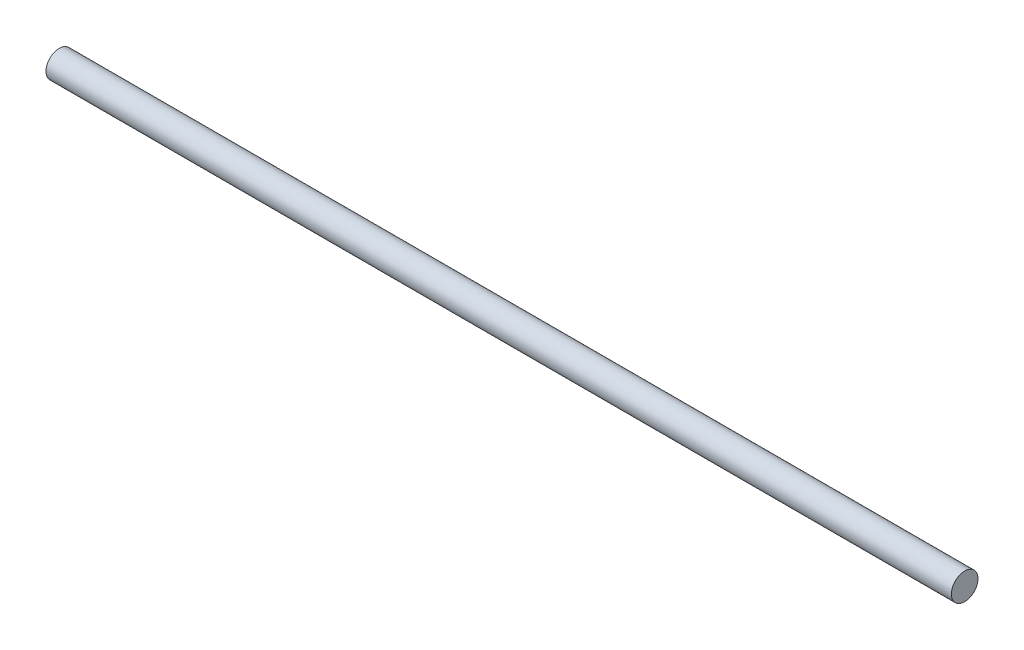
ISO-10303-21;
HEADER;
FILE_DESCRIPTION(('STEP AP214'),'2;1');
FILE_NAME('part.step','',(''),(''),'','','');
FILE_SCHEMA(('AUTOMOTIVE_DESIGN { 1 0 10303 214 1 1 1 1 }'));
ENDSEC;
DATA;
#1=APPLICATION_CONTEXT('core data for automotive mechanical design processes');
#2=APPLICATION_PROTOCOL_DEFINITION('international standard','automotive_design',2000,#1);
#3=PRODUCT_CONTEXT('',#1,'mechanical');
#4=PRODUCT('Part','Part','',(#3));
#5=PRODUCT_RELATED_PRODUCT_CATEGORY('part','',(#4));
#6=PRODUCT_DEFINITION_FORMATION('','',#4);
#7=PRODUCT_DEFINITION_CONTEXT('part definition',#1,'design');
#8=PRODUCT_DEFINITION('design','',#6,#7);
#9=PRODUCT_DEFINITION_SHAPE('','',#8);
#10=(LENGTH_UNIT() NAMED_UNIT(*) SI_UNIT(.MILLI.,.METRE.));
#11=(NAMED_UNIT(*) PLANE_ANGLE_UNIT() SI_UNIT($,.RADIAN.));
#12=(NAMED_UNIT(*) SI_UNIT($,.STERADIAN.) SOLID_ANGLE_UNIT());
#13=UNCERTAINTY_MEASURE_WITH_UNIT(LENGTH_MEASURE(1.E-05),#10,'distance_accuracy_value','');
#14=(GEOMETRIC_REPRESENTATION_CONTEXT(3) GLOBAL_UNCERTAINTY_ASSIGNED_CONTEXT((#13)) GLOBAL_UNIT_ASSIGNED_CONTEXT((#10,
#11,#12)) REPRESENTATION_CONTEXT('',''));
#15=CARTESIAN_POINT('',(0.,0.,0.));
#16=DIRECTION('',(0.,0.,1.));
#17=DIRECTION('',(1.,0.,0.));
#18=AXIS2_PLACEMENT_3D('',#15,#16,#17);
#19=CARTESIAN_POINT('',(170.,0.,0.));
#20=DIRECTION('',(-1.,0.,0.));
#21=DIRECTION('',(0.,0.,1.));
#22=AXIS2_PLACEMENT_3D('',#19,#20,#21);
#23=CYLINDRICAL_SURFACE('',#22,5.);
#24=CARTESIAN_POINT('',(170.,0.,0.));
#25=DIRECTION('',(1.,0.,0.));
#26=DIRECTION('',(0.,0.,-1.));
#27=AXIS2_PLACEMENT_3D('',#24,#25,#26);
#28=CIRCLE('',#27,5.);
#29=CARTESIAN_POINT('',(170.,0.,-5.));
#30=VERTEX_POINT('',#29);
#31=EDGE_CURVE('E10',#30,#30,#28,.T.);
#32=ORIENTED_EDGE('',*,*,#31,.F.);
#33=EDGE_LOOP('',(#32));
#34=FACE_BOUND('',#33,.T.);
#35=CARTESIAN_POINT('',(-170.,0.,0.));
#36=DIRECTION('',(1.,0.,0.));
#37=DIRECTION('',(0.,0.,-1.));
#38=AXIS2_PLACEMENT_3D('',#35,#36,#37);
#39=CIRCLE('',#38,5.);
#40=CARTESIAN_POINT('',(-170.,0.,-5.));
#41=VERTEX_POINT('',#40);
#42=EDGE_CURVE('E34',#41,#41,#39,.T.);
#43=ORIENTED_EDGE('',*,*,#42,.T.);
#44=EDGE_LOOP('',(#43));
#45=FACE_BOUND('',#44,.T.);
#46=ADVANCED_FACE('F31',(#34,#45),#23,.T.);
#47=CARTESIAN_POINT('',(170.,0.,0.));
#48=DIRECTION('',(1.,0.,0.));
#49=DIRECTION('',(0.,0.,-1.));
#50=AXIS2_PLACEMENT_3D('',#47,#48,#49);
#51=PLANE('',#50);
#52=ORIENTED_EDGE('',*,*,#31,.T.);
#53=EDGE_LOOP('',(#52));
#54=FACE_BOUND('',#53,.T.);
#55=ADVANCED_FACE('F46',(#54),#51,.T.);
#56=CARTESIAN_POINT('',(-170.,0.,0.));
#57=DIRECTION('',(1.,0.,0.));
#58=DIRECTION('',(0.,0.,-1.));
#59=AXIS2_PLACEMENT_3D('',#56,#57,#58);
#60=PLANE('',#59);
#61=ORIENTED_EDGE('',*,*,#42,.F.);
#62=EDGE_LOOP('',(#61));
#63=FACE_BOUND('',#62,.T.);
#64=ADVANCED_FACE('F44',(#63),#60,.F.);
#65=CLOSED_SHELL('',(#46,#55,#64));
#66=MANIFOLD_SOLID_BREP('B2',#65);
#67=ADVANCED_BREP_SHAPE_REPRESENTATION('',(#18,#66),#14);
#68=SHAPE_DEFINITION_REPRESENTATION(#9,#67);
ENDSEC;
END-ISO-10303-21;
